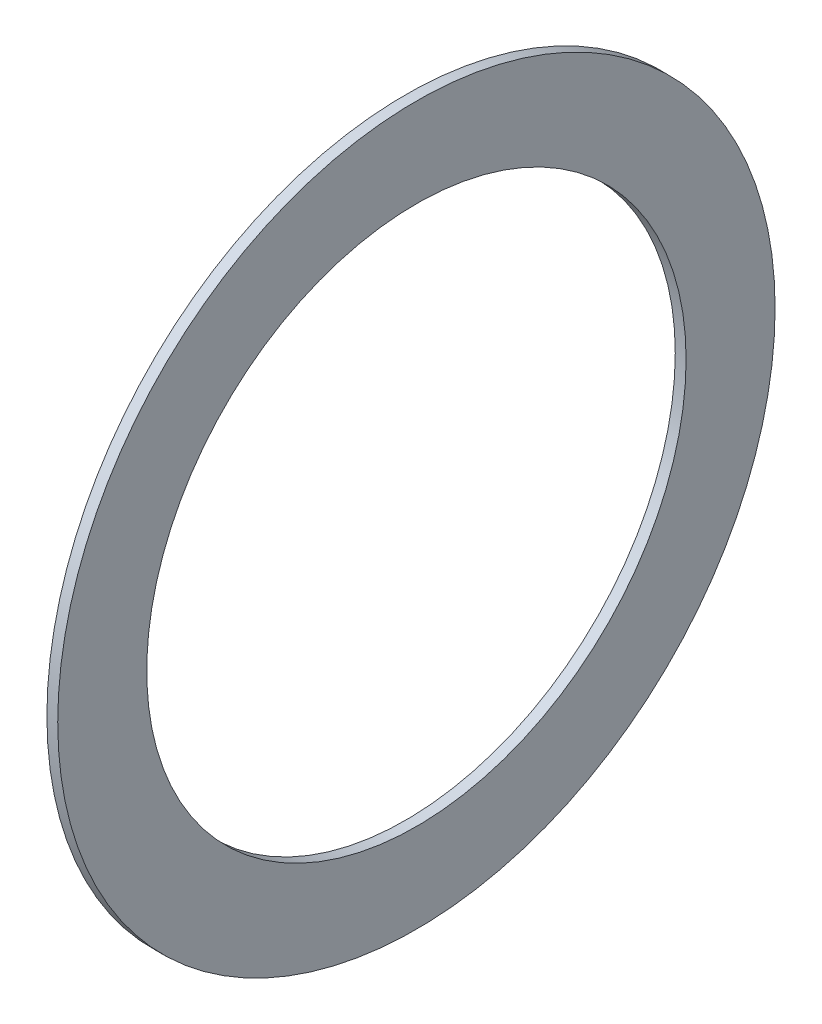
ISO-10303-21;
HEADER;
FILE_DESCRIPTION(('STEP AP214'),'2;1');
FILE_NAME('part.step','',(''),(''),'','','');
FILE_SCHEMA(('AUTOMOTIVE_DESIGN { 1 0 10303 214 1 1 1 1 }'));
ENDSEC;
DATA;
#1=APPLICATION_CONTEXT('core data for automotive mechanical design processes');
#2=APPLICATION_PROTOCOL_DEFINITION('international standard','automotive_design',2000,#1);
#3=PRODUCT_CONTEXT('',#1,'mechanical');
#4=PRODUCT('Part','Part','',(#3));
#5=PRODUCT_RELATED_PRODUCT_CATEGORY('part','',(#4));
#6=PRODUCT_DEFINITION_FORMATION('','',#4);
#7=PRODUCT_DEFINITION_CONTEXT('part definition',#1,'design');
#8=PRODUCT_DEFINITION('design','',#6,#7);
#9=PRODUCT_DEFINITION_SHAPE('','',#8);
#10=(LENGTH_UNIT() NAMED_UNIT(*) SI_UNIT(.MILLI.,.METRE.));
#11=(NAMED_UNIT(*) PLANE_ANGLE_UNIT() SI_UNIT($,.RADIAN.));
#12=(NAMED_UNIT(*) SI_UNIT($,.STERADIAN.) SOLID_ANGLE_UNIT());
#13=UNCERTAINTY_MEASURE_WITH_UNIT(LENGTH_MEASURE(1.E-05),#10,'distance_accuracy_value','');
#14=(GEOMETRIC_REPRESENTATION_CONTEXT(3) GLOBAL_UNCERTAINTY_ASSIGNED_CONTEXT((#13)) GLOBAL_UNIT_ASSIGNED_CONTEXT((#10,
#11,#12)) REPRESENTATION_CONTEXT('',''));
#15=CARTESIAN_POINT('',(0.,0.,0.));
#16=DIRECTION('',(0.,0.,1.));
#17=DIRECTION('',(1.,0.,0.));
#18=AXIS2_PLACEMENT_3D('',#15,#16,#17);
#19=CARTESIAN_POINT('',(2.8125,4.655,0.));
#20=DIRECTION('',(-1.,0.,0.));
#21=DIRECTION('',(0.,0.,1.));
#22=AXIS2_PLACEMENT_3D('',#19,#20,#21);
#23=PLANE('',#22);
#24=CARTESIAN_POINT('',(2.8125,0.,0.));
#25=DIRECTION('',(1.,0.,0.));
#26=DIRECTION('',(0.,0.,-1.));
#27=AXIS2_PLACEMENT_3D('',#24,#25,#26);
#28=CIRCLE('',#27,3.5);
#29=CARTESIAN_POINT('',(2.8125,0.,-3.5));
#30=VERTEX_POINT('',#29);
#31=EDGE_CURVE('E5',#30,#30,#28,.T.);
#32=ORIENTED_EDGE('',*,*,#31,.T.);
#33=EDGE_LOOP('',(#32));
#34=FACE_BOUND('',#33,.T.);
#35=CARTESIAN_POINT('',(2.8125,0.,0.));
#36=DIRECTION('',(1.,0.,0.));
#37=DIRECTION('',(0.,0.,-1.));
#38=AXIS2_PLACEMENT_3D('',#35,#36,#37);
#39=CIRCLE('',#38,4.655);
#40=CARTESIAN_POINT('',(2.8125,0.,-4.655));
#41=VERTEX_POINT('',#40);
#42=EDGE_CURVE('E9',#41,#41,#39,.T.);
#43=ORIENTED_EDGE('',*,*,#42,.F.);
#44=EDGE_LOOP('',(#43));
#45=FACE_BOUND('',#44,.T.);
#46=ADVANCED_FACE('F13',(#34,#45),#23,.T.);
#47=CARTESIAN_POINT('',(2.95305,0.,0.));
#48=DIRECTION('',(1.,0.,0.));
#49=DIRECTION('',(0.,0.,-1.));
#50=AXIS2_PLACEMENT_3D('',#47,#48,#49);
#51=CYLINDRICAL_SURFACE('',#50,3.5);
#52=CARTESIAN_POINT('',(2.95305,0.,0.));
#53=DIRECTION('',(1.,0.,0.));
#54=DIRECTION('',(0.,0.,-1.));
#55=AXIS2_PLACEMENT_3D('',#52,#53,#54);
#56=CIRCLE('',#55,3.5);
#57=CARTESIAN_POINT('',(2.95305,0.,-3.5));
#58=VERTEX_POINT('',#57);
#59=EDGE_CURVE('E24',#58,#58,#56,.T.);
#60=ORIENTED_EDGE('',*,*,#59,.T.);
#61=EDGE_LOOP('',(#60));
#62=FACE_BOUND('',#61,.T.);
#63=ORIENTED_EDGE('',*,*,#31,.F.);
#64=EDGE_LOOP('',(#63));
#65=FACE_BOUND('',#64,.T.);
#66=ADVANCED_FACE('F30',(#62,#65),#51,.F.);
#67=CARTESIAN_POINT('',(2.95305,0.,0.));
#68=DIRECTION('',(1.,0.,0.));
#69=DIRECTION('',(0.,0.,-1.));
#70=AXIS2_PLACEMENT_3D('',#67,#68,#69);
#71=CYLINDRICAL_SURFACE('',#70,4.655);
#72=ORIENTED_EDGE('',*,*,#42,.T.);
#73=EDGE_LOOP('',(#72));
#74=FACE_BOUND('',#73,.T.);
#75=CARTESIAN_POINT('',(2.95305,0.,0.));
#76=DIRECTION('',(1.,0.,0.));
#77=DIRECTION('',(0.,0.,-1.));
#78=AXIS2_PLACEMENT_3D('',#75,#76,#77);
#79=CIRCLE('',#78,4.655);
#80=CARTESIAN_POINT('',(2.95305,0.,-4.655));
#81=VERTEX_POINT('',#80);
#82=EDGE_CURVE('E39',#81,#81,#79,.T.);
#83=ORIENTED_EDGE('',*,*,#82,.F.);
#84=EDGE_LOOP('',(#83));
#85=FACE_BOUND('',#84,.T.);
#86=ADVANCED_FACE('F43',(#74,#85),#71,.T.);
#87=CARTESIAN_POINT('',(2.95305,3.5,0.));
#88=DIRECTION('',(1.,0.,0.));
#89=DIRECTION('',(0.,0.,-1.));
#90=AXIS2_PLACEMENT_3D('',#87,#88,#89);
#91=PLANE('',#90);
#92=ORIENTED_EDGE('',*,*,#82,.T.);
#93=EDGE_LOOP('',(#92));
#94=FACE_BOUND('',#93,.T.);
#95=ORIENTED_EDGE('',*,*,#59,.F.);
#96=EDGE_LOOP('',(#95));
#97=FACE_BOUND('',#96,.T.);
#98=ADVANCED_FACE('F54',(#94,#97),#91,.T.);
#99=CLOSED_SHELL('',(#46,#66,#86,#98));
#100=MANIFOLD_SOLID_BREP('B1',#99);
#101=ADVANCED_BREP_SHAPE_REPRESENTATION('',(#18,#100),#14);
#102=SHAPE_DEFINITION_REPRESENTATION(#9,#101);
ENDSEC;
END-ISO-10303-21;
